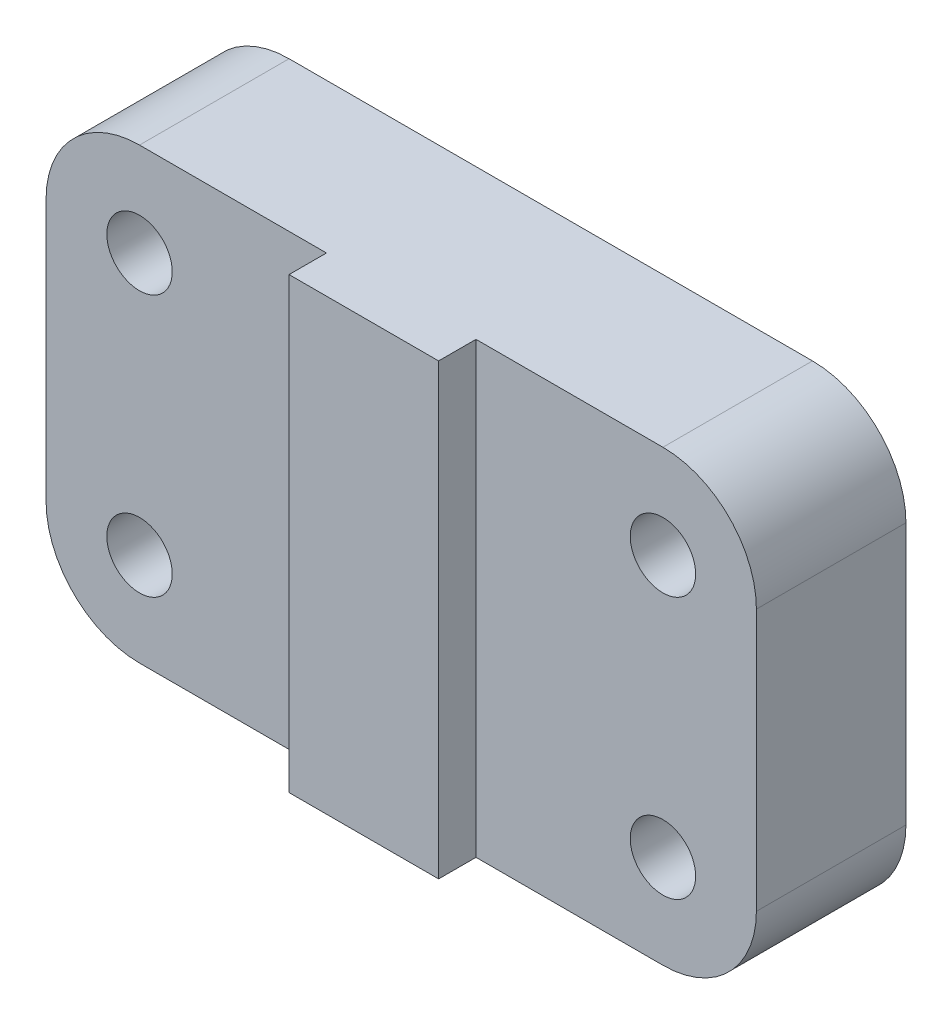
ISO-10303-21;
HEADER;
FILE_DESCRIPTION(('STEP AP214'),'2;1');
FILE_NAME('part.step','',(''),(''),'','','');
FILE_SCHEMA(('AUTOMOTIVE_DESIGN { 1 0 10303 214 1 1 1 1 }'));
ENDSEC;
DATA;
#1=APPLICATION_CONTEXT('core data for automotive mechanical design processes');
#2=APPLICATION_PROTOCOL_DEFINITION('international standard','automotive_design',2000,#1);
#3=PRODUCT_CONTEXT('',#1,'mechanical');
#4=PRODUCT('Part','Part','',(#3));
#5=PRODUCT_RELATED_PRODUCT_CATEGORY('part','',(#4));
#6=PRODUCT_DEFINITION_FORMATION('','',#4);
#7=PRODUCT_DEFINITION_CONTEXT('part definition',#1,'design');
#8=PRODUCT_DEFINITION('design','',#6,#7);
#9=PRODUCT_DEFINITION_SHAPE('','',#8);
#10=(LENGTH_UNIT() NAMED_UNIT(*) SI_UNIT(.MILLI.,.METRE.));
#11=(NAMED_UNIT(*) PLANE_ANGLE_UNIT() SI_UNIT($,.RADIAN.));
#12=(NAMED_UNIT(*) SI_UNIT($,.STERADIAN.) SOLID_ANGLE_UNIT());
#13=UNCERTAINTY_MEASURE_WITH_UNIT(LENGTH_MEASURE(1.E-05),#10,'distance_accuracy_value','');
#14=(GEOMETRIC_REPRESENTATION_CONTEXT(3) GLOBAL_UNCERTAINTY_ASSIGNED_CONTEXT((#13)) GLOBAL_UNIT_ASSIGNED_CONTEXT((#10,
#11,#12)) REPRESENTATION_CONTEXT('',''));
#15=CARTESIAN_POINT('',(0.,0.,0.));
#16=DIRECTION('',(0.,0.,1.));
#17=DIRECTION('',(1.,0.,0.));
#18=AXIS2_PLACEMENT_3D('',#15,#16,#17);
#19=CARTESIAN_POINT('',(-70.,-35.,40.));
#20=DIRECTION('',(0.,0.,1.));
#21=DIRECTION('',(1.,0.,0.));
#22=AXIS2_PLACEMENT_3D('',#19,#20,#21);
#23=PLANE('',#22);
#24=DIRECTION('',(0.,-1.,0.));
#25=VECTOR('',#24,1.);
#26=CARTESIAN_POINT('',(-20.,60.,40.));
#27=LINE('',#26,#25);
#28=CARTESIAN_POINT('',(-20.,60.,40.));
#29=VERTEX_POINT('',#28);
#30=CARTESIAN_POINT('',(-20.,-60.,40.));
#31=VERTEX_POINT('',#30);
#32=EDGE_CURVE('E55',#29,#31,#27,.T.);
#33=ORIENTED_EDGE('',*,*,#32,.F.);
#34=DIRECTION('',(-1.,0.,0.));
#35=VECTOR('',#34,1.);
#36=CARTESIAN_POINT('',(69.9999999999998,60.,40.));
#37=LINE('',#36,#35);
#38=CARTESIAN_POINT('',(-69.9999999999998,60.,40.));
#39=VERTEX_POINT('',#38);
#40=EDGE_CURVE('E205',#29,#39,#37,.T.);
#41=ORIENTED_EDGE('',*,*,#40,.T.);
#42=CARTESIAN_POINT('',(-70.,35.,40.));
#43=DIRECTION('',(0.,0.,1.));
#44=DIRECTION('',(-1.,0.,0.));
#45=AXIS2_PLACEMENT_3D('',#42,#43,#44);
#46=CIRCLE('',#45,25.);
#47=CARTESIAN_POINT('',(-95.,34.9999999999998,40.));
#48=VERTEX_POINT('',#47);
#49=EDGE_CURVE('E208',#39,#48,#46,.T.);
#50=ORIENTED_EDGE('',*,*,#49,.T.);
#51=DIRECTION('',(0.,-1.,0.));
#52=VECTOR('',#51,1.);
#53=CARTESIAN_POINT('',(-95.,34.9999999999998,40.));
#54=LINE('',#53,#52);
#55=CARTESIAN_POINT('',(-95.,-34.9999999999998,40.));
#56=VERTEX_POINT('',#55);
#57=EDGE_CURVE('E210',#48,#56,#54,.T.);
#58=ORIENTED_EDGE('',*,*,#57,.T.);
#59=CARTESIAN_POINT('',(-70.,-35.,40.));
#60=DIRECTION('',(0.,0.,1.));
#61=DIRECTION('',(1.,0.,0.));
#62=AXIS2_PLACEMENT_3D('',#59,#60,#61);
#63=CIRCLE('',#62,25.);
#64=CARTESIAN_POINT('',(-69.9999999999998,-60.,40.));
#65=VERTEX_POINT('',#64);
#66=EDGE_CURVE('E192',#56,#65,#63,.T.);
#67=ORIENTED_EDGE('',*,*,#66,.T.);
#68=DIRECTION('',(1.,0.,0.));
#69=VECTOR('',#68,1.);
#70=CARTESIAN_POINT('',(69.9999999999998,-60.,40.));
#71=LINE('',#70,#69);
#72=EDGE_CURVE('E197',#65,#31,#71,.T.);
#73=ORIENTED_EDGE('',*,*,#72,.T.);
#74=EDGE_LOOP('',(#33,#41,#50,#58,#67,#73));
#75=FACE_BOUND('',#74,.T.);
#76=CARTESIAN_POINT('',(-70.,-35.,40.));
#77=DIRECTION('',(0.,0.,1.));
#78=DIRECTION('',(1.,0.,0.));
#79=AXIS2_PLACEMENT_3D('',#76,#77,#78);
#80=CIRCLE('',#79,8.74999999999999);
#81=CARTESIAN_POINT('',(-61.25,-35.,40.));
#82=VERTEX_POINT('',#81);
#83=EDGE_CURVE('E173',#82,#82,#80,.T.);
#84=ORIENTED_EDGE('',*,*,#83,.F.);
#85=EDGE_LOOP('',(#84));
#86=FACE_BOUND('',#85,.T.);
#87=CARTESIAN_POINT('',(-70.,35.,40.));
#88=DIRECTION('',(0.,0.,1.));
#89=DIRECTION('',(1.,0.,0.));
#90=AXIS2_PLACEMENT_3D('',#87,#88,#89);
#91=CIRCLE('',#90,8.74999999999999);
#92=CARTESIAN_POINT('',(-61.25,35.,40.));
#93=VERTEX_POINT('',#92);
#94=EDGE_CURVE('E162',#93,#93,#91,.T.);
#95=ORIENTED_EDGE('',*,*,#94,.F.);
#96=EDGE_LOOP('',(#95));
#97=FACE_BOUND('',#96,.T.);
#98=ADVANCED_FACE('F40',(#75,#86,#97),#23,.T.);
#99=CARTESIAN_POINT('',(-70.,-35.,40.));
#100=DIRECTION('',(0.,0.,-1.));
#101=DIRECTION('',(-1.,0.,0.));
#102=AXIS2_PLACEMENT_3D('',#99,#100,#101);
#103=CYLINDRICAL_SURFACE('',#102,25.);
#104=CARTESIAN_POINT('',(-70.,-35.,0.));
#105=DIRECTION('',(0.,0.,1.));
#106=DIRECTION('',(1.,0.,0.));
#107=AXIS2_PLACEMENT_3D('',#104,#105,#106);
#108=CIRCLE('',#107,25.);
#109=CARTESIAN_POINT('',(-95.,-34.9999999999998,0.));
#110=VERTEX_POINT('',#109);
#111=CARTESIAN_POINT('',(-69.9999999999998,-60.,0.));
#112=VERTEX_POINT('',#111);
#113=EDGE_CURVE('E191',#110,#112,#108,.T.);
#114=ORIENTED_EDGE('',*,*,#113,.T.);
#115=DIRECTION('',(0.,0.,-1.));
#116=VECTOR('',#115,1.);
#117=CARTESIAN_POINT('',(-69.9999999999998,-60.,40.));
#118=LINE('',#117,#116);
#119=EDGE_CURVE('E11',#65,#112,#118,.T.);
#120=ORIENTED_EDGE('',*,*,#119,.F.);
#121=ORIENTED_EDGE('',*,*,#66,.F.);
#122=DIRECTION('',(0.,0.,-1.));
#123=VECTOR('',#122,1.);
#124=CARTESIAN_POINT('',(-95.,-34.9999999999998,40.));
#125=LINE('',#124,#123);
#126=EDGE_CURVE('E212',#56,#110,#125,.T.);
#127=ORIENTED_EDGE('',*,*,#126,.T.);
#128=EDGE_LOOP('',(#114,#120,#121,#127));
#129=FACE_BOUND('',#128,.T.);
#130=ADVANCED_FACE('F42',(#129),#103,.T.);
#131=CARTESIAN_POINT('',(69.9999999999998,-60.,40.));
#132=DIRECTION('',(0.,1.,0.));
#133=DIRECTION('',(-1.,0.,0.));
#134=AXIS2_PLACEMENT_3D('',#131,#132,#133);
#135=PLANE('',#134);
#136=DIRECTION('',(1.,0.,0.));
#137=VECTOR('',#136,1.);
#138=CARTESIAN_POINT('',(69.9999999999998,-60.,0.));
#139=LINE('',#138,#137);
#140=CARTESIAN_POINT('',(69.9999999999998,-60.,0.));
#141=VERTEX_POINT('',#140);
#142=EDGE_CURVE('E215',#112,#141,#139,.T.);
#143=ORIENTED_EDGE('',*,*,#142,.T.);
#144=DIRECTION('',(0.,0.,-1.));
#145=VECTOR('',#144,1.);
#146=CARTESIAN_POINT('',(69.9999999999998,-60.,40.));
#147=LINE('',#146,#145);
#148=CARTESIAN_POINT('',(69.9999999999998,-60.,40.));
#149=VERTEX_POINT('',#148);
#150=EDGE_CURVE('E48',#149,#141,#147,.T.);
#151=ORIENTED_EDGE('',*,*,#150,.F.);
#152=CARTESIAN_POINT('',(20.,-60.,40.));
#153=VERTEX_POINT('',#152);
#154=EDGE_CURVE('E195',#153,#149,#71,.T.);
#155=ORIENTED_EDGE('',*,*,#154,.F.);
#156=DIRECTION('',(0.,0.,-1.));
#157=VECTOR('',#156,1.);
#158=CARTESIAN_POINT('',(20.,-60.,50.));
#159=LINE('',#158,#157);
#160=CARTESIAN_POINT('',(20.,-60.,50.));
#161=VERTEX_POINT('',#160);
#162=EDGE_CURVE('E147',#161,#153,#159,.T.);
#163=ORIENTED_EDGE('',*,*,#162,.F.);
#164=DIRECTION('',(1.,0.,0.));
#165=VECTOR('',#164,1.);
#166=CARTESIAN_POINT('',(-20.,-60.,50.));
#167=LINE('',#166,#165);
#168=CARTESIAN_POINT('',(-20.,-60.,50.));
#169=VERTEX_POINT('',#168);
#170=EDGE_CURVE('E141',#169,#161,#167,.T.);
#171=ORIENTED_EDGE('',*,*,#170,.F.);
#172=DIRECTION('',(0.,0.,-1.));
#173=VECTOR('',#172,1.);
#174=CARTESIAN_POINT('',(-20.,-60.,50.));
#175=LINE('',#174,#173);
#176=EDGE_CURVE('E145',#169,#31,#175,.T.);
#177=ORIENTED_EDGE('',*,*,#176,.T.);
#178=ORIENTED_EDGE('',*,*,#72,.F.);
#179=ORIENTED_EDGE('',*,*,#119,.T.);
#180=EDGE_LOOP('',(#143,#151,#155,#163,#171,#177,#178,#179));
#181=FACE_BOUND('',#180,.T.);
#182=ADVANCED_FACE('F143',(#181),#135,.F.);
#183=CARTESIAN_POINT('',(70.,-35.,40.));
#184=DIRECTION('',(0.,0.,-1.));
#185=DIRECTION('',(-1.,0.,0.));
#186=AXIS2_PLACEMENT_3D('',#183,#184,#185);
#187=CYLINDRICAL_SURFACE('',#186,25.);
#188=CARTESIAN_POINT('',(70.,-35.,0.));
#189=DIRECTION('',(0.,0.,1.));
#190=DIRECTION('',(1.,0.,0.));
#191=AXIS2_PLACEMENT_3D('',#188,#189,#190);
#192=CIRCLE('',#191,25.);
#193=CARTESIAN_POINT('',(95.,-34.9999999999998,0.));
#194=VERTEX_POINT('',#193);
#195=EDGE_CURVE('E217',#141,#194,#192,.T.);
#196=ORIENTED_EDGE('',*,*,#195,.T.);
#197=DIRECTION('',(0.,0.,-1.));
#198=VECTOR('',#197,1.);
#199=CARTESIAN_POINT('',(95.,-34.9999999999998,40.));
#200=LINE('',#199,#198);
#201=CARTESIAN_POINT('',(95.,-34.9999999999998,40.));
#202=VERTEX_POINT('',#201);
#203=EDGE_CURVE('E242',#202,#194,#200,.T.);
#204=ORIENTED_EDGE('',*,*,#203,.F.);
#205=CARTESIAN_POINT('',(70.,-35.,40.));
#206=DIRECTION('',(0.,0.,1.));
#207=DIRECTION('',(1.,0.,0.));
#208=AXIS2_PLACEMENT_3D('',#205,#206,#207);
#209=CIRCLE('',#208,25.);
#210=EDGE_CURVE('E199',#149,#202,#209,.T.);
#211=ORIENTED_EDGE('',*,*,#210,.F.);
#212=ORIENTED_EDGE('',*,*,#150,.T.);
#213=EDGE_LOOP('',(#196,#204,#211,#212));
#214=FACE_BOUND('',#213,.T.);
#215=ADVANCED_FACE('F249',(#214),#187,.T.);
#216=CARTESIAN_POINT('',(95.,34.9999999999999,40.));
#217=DIRECTION('',(-1.,0.,0.));
#218=DIRECTION('',(0.,0.,1.));
#219=AXIS2_PLACEMENT_3D('',#216,#217,#218);
#220=PLANE('',#219);
#221=DIRECTION('',(0.,1.,0.));
#222=VECTOR('',#221,1.);
#223=CARTESIAN_POINT('',(95.,34.9999999999999,0.));
#224=LINE('',#223,#222);
#225=CARTESIAN_POINT('',(95.,34.9999999999999,0.));
#226=VERTEX_POINT('',#225);
#227=EDGE_CURVE('E219',#194,#226,#224,.T.);
#228=ORIENTED_EDGE('',*,*,#227,.T.);
#229=DIRECTION('',(0.,0.,-1.));
#230=VECTOR('',#229,1.);
#231=CARTESIAN_POINT('',(95.,34.9999999999999,40.));
#232=LINE('',#231,#230);
#233=CARTESIAN_POINT('',(95.,34.9999999999999,40.));
#234=VERTEX_POINT('',#233);
#235=EDGE_CURVE('E239',#234,#226,#232,.T.);
#236=ORIENTED_EDGE('',*,*,#235,.F.);
#237=DIRECTION('',(0.,1.,0.));
#238=VECTOR('',#237,1.);
#239=CARTESIAN_POINT('',(95.,34.9999999999999,40.));
#240=LINE('',#239,#238);
#241=EDGE_CURVE('E201',#202,#234,#240,.T.);
#242=ORIENTED_EDGE('',*,*,#241,.F.);
#243=ORIENTED_EDGE('',*,*,#203,.T.);
#244=EDGE_LOOP('',(#228,#236,#242,#243));
#245=FACE_BOUND('',#244,.T.);
#246=ADVANCED_FACE('F259',(#245),#220,.F.);
#247=CARTESIAN_POINT('',(70.,35.,40.));
#248=DIRECTION('',(0.,0.,-1.));
#249=DIRECTION('',(-1.,0.,0.));
#250=AXIS2_PLACEMENT_3D('',#247,#248,#249);
#251=CYLINDRICAL_SURFACE('',#250,25.);
#252=CARTESIAN_POINT('',(70.,35.,0.));
#253=DIRECTION('',(0.,0.,1.));
#254=DIRECTION('',(1.,0.,0.));
#255=AXIS2_PLACEMENT_3D('',#252,#253,#254);
#256=CIRCLE('',#255,25.);
#257=CARTESIAN_POINT('',(69.9999999999998,60.,0.));
#258=VERTEX_POINT('',#257);
#259=EDGE_CURVE('E221',#226,#258,#256,.T.);
#260=ORIENTED_EDGE('',*,*,#259,.T.);
#261=DIRECTION('',(0.,0.,-1.));
#262=VECTOR('',#261,1.);
#263=CARTESIAN_POINT('',(69.9999999999998,60.,40.));
#264=LINE('',#263,#262);
#265=CARTESIAN_POINT('',(69.9999999999998,60.,40.));
#266=VERTEX_POINT('',#265);
#267=EDGE_CURVE('E236',#266,#258,#264,.T.);
#268=ORIENTED_EDGE('',*,*,#267,.F.);
#269=CARTESIAN_POINT('',(70.,35.,40.));
#270=DIRECTION('',(0.,0.,1.));
#271=DIRECTION('',(1.,0.,0.));
#272=AXIS2_PLACEMENT_3D('',#269,#270,#271);
#273=CIRCLE('',#272,25.);
#274=EDGE_CURVE('E203',#234,#266,#273,.T.);
#275=ORIENTED_EDGE('',*,*,#274,.F.);
#276=ORIENTED_EDGE('',*,*,#235,.T.);
#277=EDGE_LOOP('',(#260,#268,#275,#276));
#278=FACE_BOUND('',#277,.T.);
#279=ADVANCED_FACE('F263',(#278),#251,.T.);
#280=CARTESIAN_POINT('',(69.9999999999998,60.,40.));
#281=DIRECTION('',(0.,-1.,0.));
#282=DIRECTION('',(1.,0.,0.));
#283=AXIS2_PLACEMENT_3D('',#280,#281,#282);
#284=PLANE('',#283);
#285=DIRECTION('',(-1.,0.,0.));
#286=VECTOR('',#285,1.);
#287=CARTESIAN_POINT('',(69.9999999999998,60.,0.));
#288=LINE('',#287,#286);
#289=CARTESIAN_POINT('',(-69.9999999999998,60.,0.));
#290=VERTEX_POINT('',#289);
#291=EDGE_CURVE('E223',#258,#290,#288,.T.);
#292=ORIENTED_EDGE('',*,*,#291,.T.);
#293=DIRECTION('',(0.,0.,-1.));
#294=VECTOR('',#293,1.);
#295=CARTESIAN_POINT('',(-69.9999999999998,60.,40.));
#296=LINE('',#295,#294);
#297=EDGE_CURVE('E233',#39,#290,#296,.T.);
#298=ORIENTED_EDGE('',*,*,#297,.F.);
#299=ORIENTED_EDGE('',*,*,#40,.F.);
#300=DIRECTION('',(0.,0.,-1.));
#301=VECTOR('',#300,1.);
#302=CARTESIAN_POINT('',(-20.,60.,50.));
#303=LINE('',#302,#301);
#304=CARTESIAN_POINT('',(-20.,60.,50.));
#305=VERTEX_POINT('',#304);
#306=EDGE_CURVE('E273',#305,#29,#303,.T.);
#307=ORIENTED_EDGE('',*,*,#306,.F.);
#308=DIRECTION('',(-1.,0.,0.));
#309=VECTOR('',#308,1.);
#310=CARTESIAN_POINT('',(-20.,60.,50.));
#311=LINE('',#310,#309);
#312=CARTESIAN_POINT('',(20.,60.,50.));
#313=VERTEX_POINT('',#312);
#314=EDGE_CURVE('E156',#313,#305,#311,.T.);
#315=ORIENTED_EDGE('',*,*,#314,.F.);
#316=DIRECTION('',(0.,0.,-1.));
#317=VECTOR('',#316,1.);
#318=CARTESIAN_POINT('',(20.,60.,50.));
#319=LINE('',#318,#317);
#320=CARTESIAN_POINT('',(20.,60.,40.));
#321=VERTEX_POINT('',#320);
#322=EDGE_CURVE('E167',#313,#321,#319,.T.);
#323=ORIENTED_EDGE('',*,*,#322,.T.);
#324=EDGE_CURVE('E206',#266,#321,#37,.T.);
#325=ORIENTED_EDGE('',*,*,#324,.F.);
#326=ORIENTED_EDGE('',*,*,#267,.T.);
#327=EDGE_LOOP('',(#292,#298,#299,#307,#315,#323,#325,#326));
#328=FACE_BOUND('',#327,.T.);
#329=ADVANCED_FACE('F279',(#328),#284,.F.);
#330=CARTESIAN_POINT('',(-70.,35.,40.));
#331=DIRECTION('',(0.,0.,-1.));
#332=DIRECTION('',(-1.,0.,0.));
#333=AXIS2_PLACEMENT_3D('',#330,#331,#332);
#334=CYLINDRICAL_SURFACE('',#333,25.);
#335=CARTESIAN_POINT('',(-70.,35.,0.));
#336=DIRECTION('',(0.,0.,1.));
#337=DIRECTION('',(-1.,0.,0.));
#338=AXIS2_PLACEMENT_3D('',#335,#336,#337);
#339=CIRCLE('',#338,25.);
#340=CARTESIAN_POINT('',(-95.,34.9999999999998,0.));
#341=VERTEX_POINT('',#340);
#342=EDGE_CURVE('E225',#290,#341,#339,.T.);
#343=ORIENTED_EDGE('',*,*,#342,.T.);
#344=DIRECTION('',(0.,0.,-1.));
#345=VECTOR('',#344,1.);
#346=CARTESIAN_POINT('',(-95.,34.9999999999998,40.));
#347=LINE('',#346,#345);
#348=EDGE_CURVE('E230',#48,#341,#347,.T.);
#349=ORIENTED_EDGE('',*,*,#348,.F.);
#350=ORIENTED_EDGE('',*,*,#49,.F.);
#351=ORIENTED_EDGE('',*,*,#297,.T.);
#352=EDGE_LOOP('',(#343,#349,#350,#351));
#353=FACE_BOUND('',#352,.T.);
#354=ADVANCED_FACE('F287',(#353),#334,.T.);
#355=CARTESIAN_POINT('',(-95.,34.9999999999998,40.));
#356=DIRECTION('',(1.,0.,0.));
#357=DIRECTION('',(0.,1.,0.));
#358=AXIS2_PLACEMENT_3D('',#355,#356,#357);
#359=PLANE('',#358);
#360=DIRECTION('',(0.,-1.,0.));
#361=VECTOR('',#360,1.);
#362=CARTESIAN_POINT('',(-95.,34.9999999999998,0.));
#363=LINE('',#362,#361);
#364=EDGE_CURVE('E196',#341,#110,#363,.T.);
#365=ORIENTED_EDGE('',*,*,#364,.T.);
#366=ORIENTED_EDGE('',*,*,#126,.F.);
#367=ORIENTED_EDGE('',*,*,#57,.F.);
#368=ORIENTED_EDGE('',*,*,#348,.T.);
#369=EDGE_LOOP('',(#365,#366,#367,#368));
#370=FACE_BOUND('',#369,.T.);
#371=ADVANCED_FACE('F291',(#370),#359,.F.);
#372=DIRECTION('',(0.,1.,0.));
#373=VECTOR('',#372,1.);
#374=CARTESIAN_POINT('',(20.,60.,40.));
#375=LINE('',#374,#373);
#376=EDGE_CURVE('E63',#153,#321,#375,.T.);
#377=ORIENTED_EDGE('',*,*,#376,.F.);
#378=ORIENTED_EDGE('',*,*,#154,.T.);
#379=ORIENTED_EDGE('',*,*,#210,.T.);
#380=ORIENTED_EDGE('',*,*,#241,.T.);
#381=ORIENTED_EDGE('',*,*,#274,.T.);
#382=ORIENTED_EDGE('',*,*,#324,.T.);
#383=EDGE_LOOP('',(#377,#378,#379,#380,#381,#382));
#384=FACE_BOUND('',#383,.T.);
#385=CARTESIAN_POINT('',(70.,-35.,40.));
#386=DIRECTION('',(0.,0.,1.));
#387=DIRECTION('',(1.,0.,0.));
#388=AXIS2_PLACEMENT_3D('',#385,#386,#387);
#389=CIRCLE('',#388,8.74999999999999);
#390=CARTESIAN_POINT('',(78.75,-35.,40.));
#391=VERTEX_POINT('',#390);
#392=EDGE_CURVE('E179',#391,#391,#389,.T.);
#393=ORIENTED_EDGE('',*,*,#392,.F.);
#394=EDGE_LOOP('',(#393));
#395=FACE_BOUND('',#394,.T.);
#396=CARTESIAN_POINT('',(70.,35.,40.));
#397=DIRECTION('',(0.,0.,1.));
#398=DIRECTION('',(1.,0.,0.));
#399=AXIS2_PLACEMENT_3D('',#396,#397,#398);
#400=CIRCLE('',#399,8.74999999999999);
#401=CARTESIAN_POINT('',(78.75,35.,40.));
#402=VERTEX_POINT('',#401);
#403=EDGE_CURVE('E185',#402,#402,#400,.T.);
#404=ORIENTED_EDGE('',*,*,#403,.F.);
#405=EDGE_LOOP('',(#404));
#406=FACE_BOUND('',#405,.T.);
#407=ADVANCED_FACE('F266',(#384,#395,#406),#23,.T.);
#408=CARTESIAN_POINT('',(-70.,-35.,0.));
#409=DIRECTION('',(0.,0.,1.));
#410=DIRECTION('',(1.,0.,0.));
#411=AXIS2_PLACEMENT_3D('',#408,#409,#410);
#412=PLANE('',#411);
#413=ORIENTED_EDGE('',*,*,#113,.F.);
#414=ORIENTED_EDGE('',*,*,#364,.F.);
#415=ORIENTED_EDGE('',*,*,#342,.F.);
#416=ORIENTED_EDGE('',*,*,#291,.F.);
#417=ORIENTED_EDGE('',*,*,#259,.F.);
#418=ORIENTED_EDGE('',*,*,#227,.F.);
#419=ORIENTED_EDGE('',*,*,#195,.F.);
#420=ORIENTED_EDGE('',*,*,#142,.F.);
#421=EDGE_LOOP('',(#413,#414,#415,#416,#417,#418,#419,#420));
#422=FACE_BOUND('',#421,.T.);
#423=ADVANCED_FACE('F254',(#422),#412,.F.);
#424=CARTESIAN_POINT('',(70.,35.,15.));
#425=DIRECTION('',(0.,0.,1.));
#426=DIRECTION('',(1.,0.,0.));
#427=AXIS2_PLACEMENT_3D('',#424,#425,#426);
#428=CONICAL_SURFACE('',#427,8.74999999999999,1.02974425867665);
#429=CARTESIAN_POINT('',(70.,35.,9.74246958350885));
#430=VERTEX_POINT('',#429);
#431=VERTEX_LOOP('',#430);
#432=FACE_BOUND('',#431,.T.);
#433=CARTESIAN_POINT('',(70.,35.,15.));
#434=DIRECTION('',(0.,0.,1.));
#435=DIRECTION('',(1.,0.,0.));
#436=AXIS2_PLACEMENT_3D('',#433,#434,#435);
#437=CIRCLE('',#436,8.74999999999999);
#438=CARTESIAN_POINT('',(78.75,35.,15.));
#439=VERTEX_POINT('',#438);
#440=EDGE_CURVE('E188',#439,#439,#437,.T.);
#441=ORIENTED_EDGE('',*,*,#440,.T.);
#442=EDGE_LOOP('',(#441));
#443=FACE_BOUND('',#442,.T.);
#444=ADVANCED_FACE('F310',(#432,#443),#428,.F.);
#445=CARTESIAN_POINT('',(70.,35.,40.));
#446=DIRECTION('',(0.,0.,1.));
#447=DIRECTION('',(1.,0.,0.));
#448=AXIS2_PLACEMENT_3D('',#445,#446,#447);
#449=CYLINDRICAL_SURFACE('',#448,8.74999999999999);
#450=ORIENTED_EDGE('',*,*,#440,.F.);
#451=EDGE_LOOP('',(#450));
#452=FACE_BOUND('',#451,.T.);
#453=ORIENTED_EDGE('',*,*,#403,.T.);
#454=EDGE_LOOP('',(#453));
#455=FACE_BOUND('',#454,.T.);
#456=ADVANCED_FACE('F366',(#452,#455),#449,.F.);
#457=CARTESIAN_POINT('',(70.,-35.,15.));
#458=DIRECTION('',(0.,0.,1.));
#459=DIRECTION('',(1.,0.,0.));
#460=AXIS2_PLACEMENT_3D('',#457,#458,#459);
#461=CONICAL_SURFACE('',#460,8.74999999999999,1.02974425867665);
#462=CARTESIAN_POINT('',(70.,-35.,9.74246958350885));
#463=VERTEX_POINT('',#462);
#464=VERTEX_LOOP('',#463);
#465=FACE_BOUND('',#464,.T.);
#466=CARTESIAN_POINT('',(70.,-35.,15.));
#467=DIRECTION('',(0.,0.,1.));
#468=DIRECTION('',(1.,0.,0.));
#469=AXIS2_PLACEMENT_3D('',#466,#467,#468);
#470=CIRCLE('',#469,8.74999999999999);
#471=CARTESIAN_POINT('',(78.75,-35.,15.));
#472=VERTEX_POINT('',#471);
#473=EDGE_CURVE('E182',#472,#472,#470,.T.);
#474=ORIENTED_EDGE('',*,*,#473,.T.);
#475=EDGE_LOOP('',(#474));
#476=FACE_BOUND('',#475,.T.);
#477=ADVANCED_FACE('F376',(#465,#476),#461,.F.);
#478=CARTESIAN_POINT('',(70.,-35.,40.));
#479=DIRECTION('',(0.,0.,1.));
#480=DIRECTION('',(1.,0.,0.));
#481=AXIS2_PLACEMENT_3D('',#478,#479,#480);
#482=CYLINDRICAL_SURFACE('',#481,8.74999999999999);
#483=ORIENTED_EDGE('',*,*,#473,.F.);
#484=EDGE_LOOP('',(#483));
#485=FACE_BOUND('',#484,.T.);
#486=ORIENTED_EDGE('',*,*,#392,.T.);
#487=EDGE_LOOP('',(#486));
#488=FACE_BOUND('',#487,.T.);
#489=ADVANCED_FACE('F388',(#485,#488),#482,.F.);
#490=CARTESIAN_POINT('',(-70.,-35.,15.));
#491=DIRECTION('',(0.,0.,1.));
#492=DIRECTION('',(1.,0.,0.));
#493=AXIS2_PLACEMENT_3D('',#490,#491,#492);
#494=CONICAL_SURFACE('',#493,8.74999999999999,1.02974425867665);
#495=CARTESIAN_POINT('',(-70.,-35.,9.74246958350885));
#496=VERTEX_POINT('',#495);
#497=VERTEX_LOOP('',#496);
#498=FACE_BOUND('',#497,.T.);
#499=CARTESIAN_POINT('',(-70.,-35.,15.));
#500=DIRECTION('',(0.,0.,1.));
#501=DIRECTION('',(1.,0.,0.));
#502=AXIS2_PLACEMENT_3D('',#499,#500,#501);
#503=CIRCLE('',#502,8.74999999999999);
#504=CARTESIAN_POINT('',(-61.25,-35.,15.));
#505=VERTEX_POINT('',#504);
#506=EDGE_CURVE('E176',#505,#505,#503,.T.);
#507=ORIENTED_EDGE('',*,*,#506,.T.);
#508=EDGE_LOOP('',(#507));
#509=FACE_BOUND('',#508,.T.);
#510=ADVANCED_FACE('F398',(#498,#509),#494,.F.);
#511=CARTESIAN_POINT('',(-70.,-35.,40.));
#512=DIRECTION('',(0.,0.,1.));
#513=DIRECTION('',(1.,0.,0.));
#514=AXIS2_PLACEMENT_3D('',#511,#512,#513);
#515=CYLINDRICAL_SURFACE('',#514,8.74999999999999);
#516=ORIENTED_EDGE('',*,*,#506,.F.);
#517=EDGE_LOOP('',(#516));
#518=FACE_BOUND('',#517,.T.);
#519=ORIENTED_EDGE('',*,*,#83,.T.);
#520=EDGE_LOOP('',(#519));
#521=FACE_BOUND('',#520,.T.);
#522=ADVANCED_FACE('F410',(#518,#521),#515,.F.);
#523=CARTESIAN_POINT('',(-70.,35.,15.));
#524=DIRECTION('',(0.,0.,1.));
#525=DIRECTION('',(1.,0.,0.));
#526=AXIS2_PLACEMENT_3D('',#523,#524,#525);
#527=CONICAL_SURFACE('',#526,8.74999999999999,1.02974425867665);
#528=CARTESIAN_POINT('',(-70.,35.,9.74246958350885));
#529=VERTEX_POINT('',#528);
#530=VERTEX_LOOP('',#529);
#531=FACE_BOUND('',#530,.T.);
#532=CARTESIAN_POINT('',(-70.,35.,15.));
#533=DIRECTION('',(0.,0.,1.));
#534=DIRECTION('',(1.,0.,0.));
#535=AXIS2_PLACEMENT_3D('',#532,#533,#534);
#536=CIRCLE('',#535,8.74999999999999);
#537=CARTESIAN_POINT('',(-61.25,35.,15.));
#538=VERTEX_POINT('',#537);
#539=EDGE_CURVE('E165',#538,#538,#536,.T.);
#540=ORIENTED_EDGE('',*,*,#539,.T.);
#541=EDGE_LOOP('',(#540));
#542=FACE_BOUND('',#541,.T.);
#543=ADVANCED_FACE('F420',(#531,#542),#527,.F.);
#544=CARTESIAN_POINT('',(-70.,35.,40.));
#545=DIRECTION('',(0.,0.,1.));
#546=DIRECTION('',(1.,0.,0.));
#547=AXIS2_PLACEMENT_3D('',#544,#545,#546);
#548=CYLINDRICAL_SURFACE('',#547,8.74999999999999);
#549=ORIENTED_EDGE('',*,*,#539,.F.);
#550=EDGE_LOOP('',(#549));
#551=FACE_BOUND('',#550,.T.);
#552=ORIENTED_EDGE('',*,*,#94,.T.);
#553=EDGE_LOOP('',(#552));
#554=FACE_BOUND('',#553,.T.);
#555=ADVANCED_FACE('F432',(#551,#554),#548,.F.);
#556=CARTESIAN_POINT('',(-20.,60.,50.));
#557=DIRECTION('',(1.,0.,0.));
#558=DIRECTION('',(0.,1.,0.));
#559=AXIS2_PLACEMENT_3D('',#556,#557,#558);
#560=PLANE('',#559);
#561=ORIENTED_EDGE('',*,*,#32,.T.);
#562=ORIENTED_EDGE('',*,*,#176,.F.);
#563=DIRECTION('',(0.,-1.,0.));
#564=VECTOR('',#563,1.);
#565=CARTESIAN_POINT('',(-20.,60.,50.));
#566=LINE('',#565,#564);
#567=EDGE_CURVE('E151',#305,#169,#566,.T.);
#568=ORIENTED_EDGE('',*,*,#567,.F.);
#569=ORIENTED_EDGE('',*,*,#306,.T.);
#570=EDGE_LOOP('',(#561,#562,#568,#569));
#571=FACE_BOUND('',#570,.T.);
#572=ADVANCED_FACE('F161',(#571),#560,.F.);
#573=CARTESIAN_POINT('',(20.,60.,50.));
#574=DIRECTION('',(-1.,0.,0.));
#575=DIRECTION('',(0.,-1.,0.));
#576=AXIS2_PLACEMENT_3D('',#573,#574,#575);
#577=PLANE('',#576);
#578=ORIENTED_EDGE('',*,*,#376,.T.);
#579=ORIENTED_EDGE('',*,*,#322,.F.);
#580=DIRECTION('',(0.,1.,0.));
#581=VECTOR('',#580,1.);
#582=CARTESIAN_POINT('',(20.,60.,50.));
#583=LINE('',#582,#581);
#584=EDGE_CURVE('E150',#161,#313,#583,.T.);
#585=ORIENTED_EDGE('',*,*,#584,.F.);
#586=ORIENTED_EDGE('',*,*,#162,.T.);
#587=EDGE_LOOP('',(#578,#579,#585,#586));
#588=FACE_BOUND('',#587,.T.);
#589=ADVANCED_FACE('F269',(#588),#577,.F.);
#590=CARTESIAN_POINT('',(0.,0.,50.));
#591=DIRECTION('',(0.,0.,1.));
#592=DIRECTION('',(1.,0.,0.));
#593=AXIS2_PLACEMENT_3D('',#590,#591,#592);
#594=PLANE('',#593);
#595=ORIENTED_EDGE('',*,*,#567,.T.);
#596=ORIENTED_EDGE('',*,*,#170,.T.);
#597=ORIENTED_EDGE('',*,*,#584,.T.);
#598=ORIENTED_EDGE('',*,*,#314,.T.);
#599=EDGE_LOOP('',(#595,#596,#597,#598));
#600=FACE_BOUND('',#599,.T.);
#601=ADVANCED_FACE('F154',(#600),#594,.T.);
#602=CLOSED_SHELL('',(#98,#130,#182,#215,#246,#279,#329,#354,#371,#407,#423,#444,#456,#477,#489,
#510,#522,#543,#555,#572,#589,#601));
#603=MANIFOLD_SOLID_BREP('B2',#602);
#604=ADVANCED_BREP_SHAPE_REPRESENTATION('',(#18,#603),#14);
#605=SHAPE_DEFINITION_REPRESENTATION(#9,#604);
ENDSEC;
END-ISO-10303-21;
